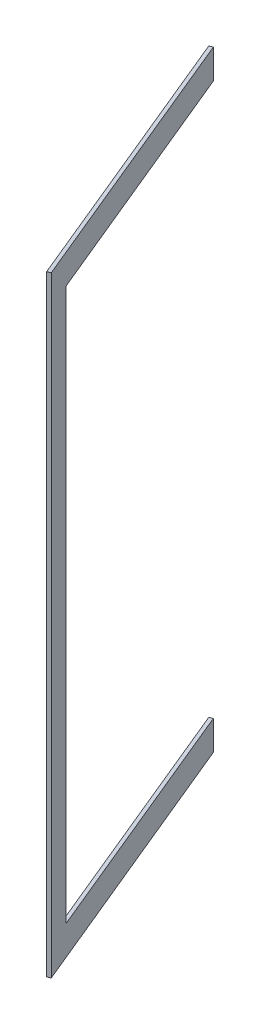
ISO-10303-21;
HEADER;
FILE_DESCRIPTION(('STEP AP214'),'2;1');
FILE_NAME('part.step','',(''),(''),'','','');
FILE_SCHEMA(('AUTOMOTIVE_DESIGN { 1 0 10303 214 1 1 1 1 }'));
ENDSEC;
DATA;
#1=APPLICATION_CONTEXT('core data for automotive mechanical design processes');
#2=APPLICATION_PROTOCOL_DEFINITION('international standard','automotive_design',2000,#1);
#3=PRODUCT_CONTEXT('',#1,'mechanical');
#4=PRODUCT('Part','Part','',(#3));
#5=PRODUCT_RELATED_PRODUCT_CATEGORY('part','',(#4));
#6=PRODUCT_DEFINITION_FORMATION('','',#4);
#7=PRODUCT_DEFINITION_CONTEXT('part definition',#1,'design');
#8=PRODUCT_DEFINITION('design','',#6,#7);
#9=PRODUCT_DEFINITION_SHAPE('','',#8);
#10=(LENGTH_UNIT() NAMED_UNIT(*) SI_UNIT(.MILLI.,.METRE.));
#11=(NAMED_UNIT(*) PLANE_ANGLE_UNIT() SI_UNIT($,.RADIAN.));
#12=(NAMED_UNIT(*) SI_UNIT($,.STERADIAN.) SOLID_ANGLE_UNIT());
#13=UNCERTAINTY_MEASURE_WITH_UNIT(LENGTH_MEASURE(1.E-05),#10,'distance_accuracy_value','');
#14=(GEOMETRIC_REPRESENTATION_CONTEXT(3) GLOBAL_UNCERTAINTY_ASSIGNED_CONTEXT((#13)) GLOBAL_UNIT_ASSIGNED_CONTEXT((#10,
#11,#12)) REPRESENTATION_CONTEXT('',''));
#15=CARTESIAN_POINT('',(0.,0.,0.));
#16=DIRECTION('',(0.,0.,1.));
#17=DIRECTION('',(1.,0.,0.));
#18=AXIS2_PLACEMENT_3D('',#15,#16,#17);
#19=CARTESIAN_POINT('',(-475.101489408786,-2540.0250000008,1547.88161638298));
#20=DIRECTION('',(-0.924042960916819,0.,0.382288642755808));
#21=DIRECTION('',(0.382288642755808,0.,0.924042960916819));
#22=AXIS2_PLACEMENT_3D('',#19,#20,#21);
#23=PLANE('',#22);
#24=DIRECTION('',(0.,1.,0.));
#25=VECTOR('',#24,1.);
#26=CARTESIAN_POINT('',(-413.257417834286,-1953.1600000001,1697.36703818547));
#27=LINE('',#26,#25);
#28=CARTESIAN_POINT('',(-413.257417834331,-2870.2,1697.36703818549));
#29=VERTEX_POINT('',#28);
#30=CARTESIAN_POINT('',(-413.257417834377,-2209.8,1697.36703818551));
#31=VERTEX_POINT('',#30);
#32=EDGE_CURVE('E91',#29,#31,#27,.T.);
#33=ORIENTED_EDGE('',*,*,#32,.T.);
#34=DIRECTION('',(0.382288642756142,0.,0.924042960916681));
#35=VECTOR('',#34,1.);
#36=CARTESIAN_POINT('',(-536.920603681156,-2209.8,1398.45651972881));
#37=LINE('',#36,#35);
#38=CARTESIAN_POINT('',(-536.920603681192,-2209.8,1398.45651972883));
#39=VERTEX_POINT('',#38);
#40=EDGE_CURVE('E20',#39,#31,#37,.T.);
#41=ORIENTED_EDGE('',*,*,#40,.F.);
#42=DIRECTION('',(0.,1.,0.));
#43=VECTOR('',#42,1.);
#44=CARTESIAN_POINT('',(-536.920603681156,-1953.1600000001,1398.45651972881));
#45=LINE('',#44,#43);
#46=CARTESIAN_POINT('',(-536.920603681174,-2241.55,1398.45651972882));
#47=VERTEX_POINT('',#46);
#48=EDGE_CURVE('E80',#47,#39,#45,.T.);
#49=ORIENTED_EDGE('',*,*,#48,.F.);
#50=DIRECTION('',(0.382288642755457,0.,0.924042960916965));
#51=VECTOR('',#50,1.);
#52=CARTESIAN_POINT('',(-536.920603681156,-2241.55,1398.45651972881));
#53=LINE('',#52,#51);
#54=CARTESIAN_POINT('',(-424.345726020323,-2241.55,1670.56510901041));
#55=VERTEX_POINT('',#54);
#56=EDGE_CURVE('E99',#47,#55,#53,.T.);
#57=ORIENTED_EDGE('',*,*,#56,.T.);
#58=DIRECTION('',(0.,1.,0.));
#59=VECTOR('',#58,1.);
#60=CARTESIAN_POINT('',(-424.345726020338,497460.000000032,1670.56510901042));
#61=LINE('',#60,#59);
#62=CARTESIAN_POINT('',(-424.345726020323,-2838.45000000001,1670.56510901041));
#63=VERTEX_POINT('',#62);
#64=EDGE_CURVE('E103',#63,#55,#61,.T.);
#65=ORIENTED_EDGE('',*,*,#64,.F.);
#66=DIRECTION('',(0.382288642755457,0.,0.924042960916965));
#67=VECTOR('',#66,1.);
#68=CARTESIAN_POINT('',(-536.920603681156,-2838.45,1398.45651972881));
#69=LINE('',#68,#67);
#70=CARTESIAN_POINT('',(-536.920603681174,-2838.45,1398.45651972882));
#71=VERTEX_POINT('',#70);
#72=EDGE_CURVE('E107',#71,#63,#69,.T.);
#73=ORIENTED_EDGE('',*,*,#72,.F.);
#74=DIRECTION('',(0.,1.,0.));
#75=VECTOR('',#74,1.);
#76=CARTESIAN_POINT('',(-536.920603681156,-3126.84000000066,1398.45651972881));
#77=LINE('',#76,#75);
#78=CARTESIAN_POINT('',(-536.920603681174,-2870.2,1398.45651972882));
#79=VERTEX_POINT('',#78);
#80=EDGE_CURVE('E114',#71,#79,#77,.F.);
#81=ORIENTED_EDGE('',*,*,#80,.T.);
#82=DIRECTION('',(0.382288642756142,0.,0.924042960916681));
#83=VECTOR('',#82,1.);
#84=CARTESIAN_POINT('',(-536.920603681156,-2870.2,1398.45651972881));
#85=LINE('',#84,#83);
#86=EDGE_CURVE('E119',#79,#29,#85,.T.);
#87=ORIENTED_EDGE('',*,*,#86,.T.);
#88=EDGE_LOOP('',(#33,#41,#49,#57,#65,#73,#81,#87));
#89=FACE_BOUND('',#88,.T.);
#90=ADVANCED_FACE('F17',(#89),#23,.T.);
#91=CARTESIAN_POINT('',(-413.257417834286,-2209.8,1697.36703818547));
#92=DIRECTION('',(0.,1.,0.));
#93=DIRECTION('',(0.,0.,1.));
#94=AXIS2_PLACEMENT_3D('',#91,#92,#93);
#95=PLANE('',#94);
#96=DIRECTION('',(-0.924042960916819,0.,0.382288642755808));
#97=VECTOR('',#96,1.);
#98=CARTESIAN_POINT('',(-413.257417834286,-2209.8,1697.36703818547));
#99=LINE('',#98,#97);
#100=CARTESIAN_POINT('',(-409.736814153376,-2209.8,1695.91051845665));
#101=VERTEX_POINT('',#100);
#102=EDGE_CURVE('E123',#31,#101,#99,.F.);
#103=ORIENTED_EDGE('',*,*,#102,.T.);
#104=DIRECTION('',(0.382288642755808,0.,0.924042960916819));
#105=VECTOR('',#104,1.);
#106=CARTESIAN_POINT('',(-471.58088572763,-2209.8,1546.42509665416));
#107=LINE('',#106,#105);
#108=CARTESIAN_POINT('',(-533.400000000028,-2209.8,1396.99999999998));
#109=VERTEX_POINT('',#108);
#110=EDGE_CURVE('E97',#101,#109,#107,.F.);
#111=ORIENTED_EDGE('',*,*,#110,.T.);
#112=DIRECTION('',(-0.924042960916819,0.,0.382288642755808));
#113=VECTOR('',#112,1.);
#114=CARTESIAN_POINT('',(-536.920603681156,-2209.8,1398.45651972881));
#115=LINE('',#114,#113);
#116=EDGE_CURVE('E87',#39,#109,#115,.F.);
#117=ORIENTED_EDGE('',*,*,#116,.F.);
#118=ORIENTED_EDGE('',*,*,#40,.T.);
#119=EDGE_LOOP('',(#103,#111,#117,#118));
#120=FACE_BOUND('',#119,.T.);
#121=ADVANCED_FACE('F96',(#120),#95,.T.);
#122=CARTESIAN_POINT('',(-536.920603681156,-1953.1600000001,1398.45651972881));
#123=DIRECTION('',(-0.382288642755808,0.,-0.924042960916819));
#124=DIRECTION('',(-0.924042960916819,0.,0.382288642755808));
#125=AXIS2_PLACEMENT_3D('',#122,#123,#124);
#126=PLANE('',#125);
#127=ORIENTED_EDGE('',*,*,#116,.T.);
#128=DIRECTION('',(0.,1.,0.));
#129=VECTOR('',#128,1.);
#130=CARTESIAN_POINT('',(-533.400000000073,-2540.0250000008,1397.00000000003));
#131=LINE('',#130,#129);
#132=CARTESIAN_POINT('',(-533.400000000038,-2241.55,1396.99999999996));
#133=VERTEX_POINT('',#132);
#134=EDGE_CURVE('E126',#109,#133,#131,.F.);
#135=ORIENTED_EDGE('',*,*,#134,.T.);
#136=DIRECTION('',(-0.924042960927179,0.,0.382288642730766));
#137=VECTOR('',#136,1.);
#138=CARTESIAN_POINT('',(-533.4,-2241.55,1397.));
#139=LINE('',#138,#137);
#140=EDGE_CURVE('E89',#133,#47,#139,.T.);
#141=ORIENTED_EDGE('',*,*,#140,.T.);
#142=ORIENTED_EDGE('',*,*,#48,.T.);
#143=EDGE_LOOP('',(#127,#135,#141,#142));
#144=FACE_BOUND('',#143,.T.);
#145=ADVANCED_FACE('F84',(#144),#126,.T.);
#146=CARTESIAN_POINT('',(-413.257417834286,-2241.55,1697.36703818547));
#147=DIRECTION('',(0.,1.,0.));
#148=DIRECTION('',(0.,0.,1.));
#149=AXIS2_PLACEMENT_3D('',#146,#147,#148);
#150=PLANE('',#149);
#151=ORIENTED_EDGE('',*,*,#56,.F.);
#152=ORIENTED_EDGE('',*,*,#140,.F.);
#153=DIRECTION('',(0.382288642755808,0.,0.924042960916819));
#154=VECTOR('',#153,1.);
#155=CARTESIAN_POINT('',(-471.58088572763,-2241.55,1546.42509665416));
#156=LINE('',#155,#154);
#157=CARTESIAN_POINT('',(-420.825122339184,-2241.55,1669.10858928139));
#158=VERTEX_POINT('',#157);
#159=EDGE_CURVE('E128',#133,#158,#156,.T.);
#160=ORIENTED_EDGE('',*,*,#159,.T.);
#161=DIRECTION('',(-0.924042960916819,0.,0.382288642755808));
#162=VECTOR('',#161,1.);
#163=CARTESIAN_POINT('',(-424.345726020338,-2241.55000000002,1670.56510901042));
#164=LINE('',#163,#162);
#165=EDGE_CURVE('E105',#55,#158,#164,.F.);
#166=ORIENTED_EDGE('',*,*,#165,.F.);
#167=EDGE_LOOP('',(#151,#152,#160,#166));
#168=FACE_BOUND('',#167,.T.);
#169=ADVANCED_FACE('F162',(#168),#150,.F.);
#170=CARTESIAN_POINT('',(-424.345726020338,497460.000000032,1670.56510901042));
#171=DIRECTION('',(-0.382288642755808,0.,-0.924042960916819));
#172=DIRECTION('',(-0.924042960916819,0.,0.382288642755808));
#173=AXIS2_PLACEMENT_3D('',#170,#171,#172);
#174=PLANE('',#173);
#175=ORIENTED_EDGE('',*,*,#165,.T.);
#176=DIRECTION('',(0.,1.,0.));
#177=VECTOR('',#176,1.);
#178=CARTESIAN_POINT('',(-420.825122339241,-2540.0250000008,1669.10858928138));
#179=LINE('',#178,#177);
#180=CARTESIAN_POINT('',(-420.825122339172,-2838.45000000001,1669.10858928142));
#181=VERTEX_POINT('',#180);
#182=EDGE_CURVE('E131',#158,#181,#179,.F.);
#183=ORIENTED_EDGE('',*,*,#182,.T.);
#184=DIRECTION('',(0.924042960903611,0.,-0.382288642787734));
#185=VECTOR('',#184,1.);
#186=CARTESIAN_POINT('',(-424.345726020338,-2838.45,1670.56510901042));
#187=LINE('',#186,#185);
#188=EDGE_CURVE('E109',#63,#181,#187,.T.);
#189=ORIENTED_EDGE('',*,*,#188,.F.);
#190=ORIENTED_EDGE('',*,*,#64,.T.);
#191=EDGE_LOOP('',(#175,#183,#189,#190));
#192=FACE_BOUND('',#191,.T.);
#193=ADVANCED_FACE('F159',(#192),#174,.T.);
#194=CARTESIAN_POINT('',(-413.257417834286,-2838.45,1697.36703818547));
#195=DIRECTION('',(0.,1.,0.));
#196=DIRECTION('',(0.,0.,1.));
#197=AXIS2_PLACEMENT_3D('',#194,#195,#196);
#198=PLANE('',#197);
#199=ORIENTED_EDGE('',*,*,#188,.T.);
#200=DIRECTION('',(0.382288642755808,0.,0.924042960916819));
#201=VECTOR('',#200,1.);
#202=CARTESIAN_POINT('',(-471.58088572763,-2838.45,1546.42509665416));
#203=LINE('',#202,#201);
#204=CARTESIAN_POINT('',(-533.400000000028,-2838.45,1396.99999999998));
#205=VERTEX_POINT('',#204);
#206=EDGE_CURVE('E134',#181,#205,#203,.F.);
#207=ORIENTED_EDGE('',*,*,#206,.T.);
#208=DIRECTION('',(0.924042960916819,0.,-0.382288642755808));
#209=VECTOR('',#208,1.);
#210=CARTESIAN_POINT('',(-536.920603681156,-2838.45,1398.45651972881));
#211=LINE('',#210,#209);
#212=EDGE_CURVE('E111',#205,#71,#211,.F.);
#213=ORIENTED_EDGE('',*,*,#212,.T.);
#214=ORIENTED_EDGE('',*,*,#72,.T.);
#215=EDGE_LOOP('',(#199,#207,#213,#214));
#216=FACE_BOUND('',#215,.T.);
#217=ADVANCED_FACE('F153',(#216),#198,.T.);
#218=CARTESIAN_POINT('',(-536.920603681156,-3126.84000000066,1398.45651972881));
#219=DIRECTION('',(0.382288642755808,0.,0.924042960916819));
#220=DIRECTION('',(0.924042960916819,0.,-0.382288642755808));
#221=AXIS2_PLACEMENT_3D('',#218,#219,#220);
#222=PLANE('',#221);
#223=ORIENTED_EDGE('',*,*,#80,.F.);
#224=ORIENTED_EDGE('',*,*,#212,.F.);
#225=DIRECTION('',(0.,1.,0.));
#226=VECTOR('',#225,1.);
#227=CARTESIAN_POINT('',(-533.400000000073,-2540.0250000008,1397.00000000003));
#228=LINE('',#227,#226);
#229=CARTESIAN_POINT('',(-533.400000000038,-2870.2,1396.99999999996));
#230=VERTEX_POINT('',#229);
#231=EDGE_CURVE('E137',#205,#230,#228,.F.);
#232=ORIENTED_EDGE('',*,*,#231,.T.);
#233=DIRECTION('',(-0.924042960927179,0.,0.382288642730766));
#234=VECTOR('',#233,1.);
#235=CARTESIAN_POINT('',(-533.4,-2870.2,1397.));
#236=LINE('',#235,#234);
#237=EDGE_CURVE('E116',#230,#79,#236,.T.);
#238=ORIENTED_EDGE('',*,*,#237,.T.);
#239=EDGE_LOOP('',(#223,#224,#232,#238));
#240=FACE_BOUND('',#239,.T.);
#241=ADVANCED_FACE('F151',(#240),#222,.F.);
#242=CARTESIAN_POINT('',(-413.257417834286,-2870.2,1697.36703818547));
#243=DIRECTION('',(0.,1.,0.));
#244=DIRECTION('',(0.,0.,1.));
#245=AXIS2_PLACEMENT_3D('',#242,#243,#244);
#246=PLANE('',#245);
#247=ORIENTED_EDGE('',*,*,#86,.F.);
#248=ORIENTED_EDGE('',*,*,#237,.F.);
#249=DIRECTION('',(0.382288642755808,0.,0.924042960916819));
#250=VECTOR('',#249,1.);
#251=CARTESIAN_POINT('',(-471.58088572763,-2870.2,1546.42509665416));
#252=LINE('',#251,#250);
#253=CARTESIAN_POINT('',(-409.736814153376,-2870.2,1695.91051845665));
#254=VERTEX_POINT('',#253);
#255=EDGE_CURVE('E26',#230,#254,#252,.T.);
#256=ORIENTED_EDGE('',*,*,#255,.T.);
#257=DIRECTION('',(-0.924042960916819,0.,0.382288642755808));
#258=VECTOR('',#257,1.);
#259=CARTESIAN_POINT('',(-413.257417834286,-2870.2,1697.36703818547));
#260=LINE('',#259,#258);
#261=EDGE_CURVE('E34',#254,#29,#260,.T.);
#262=ORIENTED_EDGE('',*,*,#261,.T.);
#263=EDGE_LOOP('',(#247,#248,#256,#262));
#264=FACE_BOUND('',#263,.T.);
#265=ADVANCED_FACE('F144',(#264),#246,.F.);
#266=CARTESIAN_POINT('',(-413.257417834286,-1953.1600000001,1697.36703818547));
#267=DIRECTION('',(-0.382288642755808,0.,-0.924042960916819));
#268=DIRECTION('',(-0.924042960916819,0.,0.382288642755808));
#269=AXIS2_PLACEMENT_3D('',#266,#267,#268);
#270=PLANE('',#269);
#271=ORIENTED_EDGE('',*,*,#32,.F.);
#272=ORIENTED_EDGE('',*,*,#261,.F.);
#273=DIRECTION('',(0.,1.,0.));
#274=VECTOR('',#273,1.);
#275=CARTESIAN_POINT('',(-409.736814153348,-2540.0250000008,1695.91051845665));
#276=LINE('',#275,#274);
#277=EDGE_CURVE('E11',#254,#101,#276,.T.);
#278=ORIENTED_EDGE('',*,*,#277,.T.);
#279=ORIENTED_EDGE('',*,*,#102,.F.);
#280=EDGE_LOOP('',(#271,#272,#278,#279));
#281=FACE_BOUND('',#280,.T.);
#282=ADVANCED_FACE('F163',(#281),#270,.F.);
#283=CARTESIAN_POINT('',(-471.58088572763,-2540.0250000008,1546.42509665416));
#284=DIRECTION('',(-0.924042960916819,0.,0.382288642755808));
#285=DIRECTION('',(0.382288642755808,0.,0.924042960916819));
#286=AXIS2_PLACEMENT_3D('',#283,#284,#285);
#287=PLANE('',#286);
#288=ORIENTED_EDGE('',*,*,#255,.F.);
#289=ORIENTED_EDGE('',*,*,#231,.F.);
#290=ORIENTED_EDGE('',*,*,#206,.F.);
#291=ORIENTED_EDGE('',*,*,#182,.F.);
#292=ORIENTED_EDGE('',*,*,#159,.F.);
#293=ORIENTED_EDGE('',*,*,#134,.F.);
#294=ORIENTED_EDGE('',*,*,#110,.F.);
#295=ORIENTED_EDGE('',*,*,#277,.F.);
#296=EDGE_LOOP('',(#288,#289,#290,#291,#292,#293,#294,#295));
#297=FACE_BOUND('',#296,.T.);
#298=ADVANCED_FACE('F147',(#297),#287,.F.);
#299=CLOSED_SHELL('',(#90,#121,#145,#169,#193,#217,#241,#265,#282,#298));
#300=MANIFOLD_SOLID_BREP('B1',#299);
#301=ADVANCED_BREP_SHAPE_REPRESENTATION('',(#18,#300),#14);
#302=SHAPE_DEFINITION_REPRESENTATION(#9,#301);
ENDSEC;
END-ISO-10303-21;
